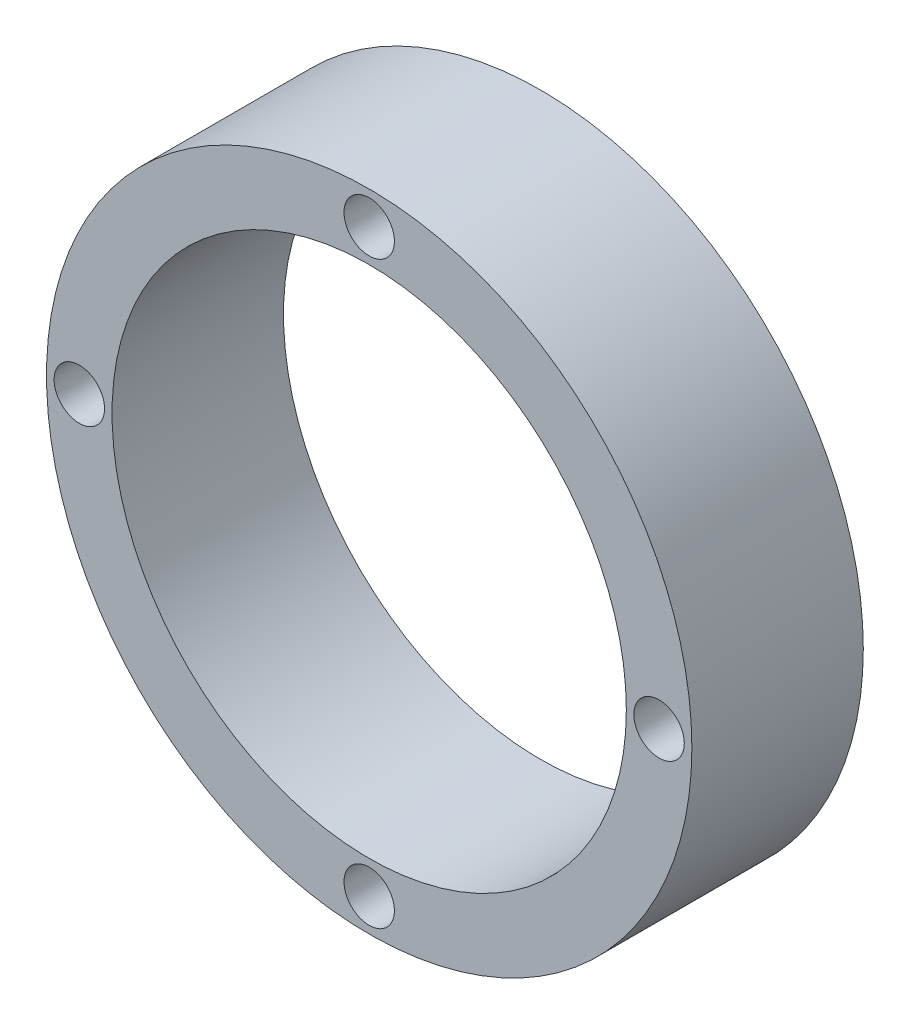
ISO-10303-21;
HEADER;
FILE_DESCRIPTION(('STEP AP214'),'2;1');
FILE_NAME('part.step','',(''),(''),'','','');
FILE_SCHEMA(('AUTOMOTIVE_DESIGN { 1 0 10303 214 1 1 1 1 }'));
ENDSEC;
DATA;
#1=APPLICATION_CONTEXT('core data for automotive mechanical design processes');
#2=APPLICATION_PROTOCOL_DEFINITION('international standard','automotive_design',2000,#1);
#3=PRODUCT_CONTEXT('',#1,'mechanical');
#4=PRODUCT('Part','Part','',(#3));
#5=PRODUCT_RELATED_PRODUCT_CATEGORY('part','',(#4));
#6=PRODUCT_DEFINITION_FORMATION('','',#4);
#7=PRODUCT_DEFINITION_CONTEXT('part definition',#1,'design');
#8=PRODUCT_DEFINITION('design','',#6,#7);
#9=PRODUCT_DEFINITION_SHAPE('','',#8);
#10=(LENGTH_UNIT() NAMED_UNIT(*) SI_UNIT(.MILLI.,.METRE.));
#11=(NAMED_UNIT(*) PLANE_ANGLE_UNIT() SI_UNIT($,.RADIAN.));
#12=(NAMED_UNIT(*) SI_UNIT($,.STERADIAN.) SOLID_ANGLE_UNIT());
#13=UNCERTAINTY_MEASURE_WITH_UNIT(LENGTH_MEASURE(1.E-05),#10,'distance_accuracy_value','');
#14=(GEOMETRIC_REPRESENTATION_CONTEXT(3) GLOBAL_UNCERTAINTY_ASSIGNED_CONTEXT((#13)) GLOBAL_UNIT_ASSIGNED_CONTEXT((#10,
#11,#12)) REPRESENTATION_CONTEXT('',''));
#15=CARTESIAN_POINT('',(0.,0.,0.));
#16=DIRECTION('',(0.,0.,1.));
#17=DIRECTION('',(1.,0.,0.));
#18=AXIS2_PLACEMENT_3D('',#15,#16,#17);
#19=CARTESIAN_POINT('',(0.,0.,17.));
#20=DIRECTION('',(0.,0.,1.));
#21=DIRECTION('',(1.,0.,0.));
#22=AXIS2_PLACEMENT_3D('',#19,#20,#21);
#23=PLANE('',#22);
#24=CARTESIAN_POINT('',(1.6234266883975E-12,-28.7454135368255,17.));
#25=DIRECTION('',(0.,0.,1.));
#26=DIRECTION('',(1.,0.,0.));
#27=AXIS2_PLACEMENT_3D('',#24,#25,#26);
#28=CIRCLE('',#27,2.50000000000174);
#29=CARTESIAN_POINT('',(2.50000000000337,-28.7454135368255,17.));
#30=VERTEX_POINT('',#29);
#31=EDGE_CURVE('E58',#30,#30,#28,.T.);
#32=ORIENTED_EDGE('',*,*,#31,.F.);
#33=EDGE_LOOP('',(#32));
#34=FACE_BOUND('',#33,.T.);
#35=CARTESIAN_POINT('',(0.,28.7454135368255,17.));
#36=DIRECTION('',(0.,0.,1.));
#37=DIRECTION('',(1.,0.,0.));
#38=AXIS2_PLACEMENT_3D('',#35,#36,#37);
#39=CIRCLE('',#38,2.5);
#40=CARTESIAN_POINT('',(2.5,28.7454135368255,17.));
#41=VERTEX_POINT('',#40);
#42=EDGE_CURVE('E46',#41,#41,#39,.T.);
#43=ORIENTED_EDGE('',*,*,#42,.F.);
#44=EDGE_LOOP('',(#43));
#45=FACE_BOUND('',#44,.T.);
#46=CARTESIAN_POINT('',(0.,0.,17.));
#47=DIRECTION('',(0.,0.,1.));
#48=DIRECTION('',(1.,0.,0.));
#49=AXIS2_PLACEMENT_3D('',#46,#47,#48);
#50=CIRCLE('',#49,32.);
#51=CARTESIAN_POINT('',(32.,0.,17.));
#52=VERTEX_POINT('',#51);
#53=EDGE_CURVE('E10',#52,#52,#50,.T.);
#54=ORIENTED_EDGE('',*,*,#53,.T.);
#55=EDGE_LOOP('',(#54));
#56=FACE_BOUND('',#55,.T.);
#57=CARTESIAN_POINT('',(0.,0.,17.));
#58=DIRECTION('',(0.,0.,1.));
#59=DIRECTION('',(1.,0.,0.));
#60=AXIS2_PLACEMENT_3D('',#57,#58,#59);
#61=CIRCLE('',#60,25.5);
#62=CARTESIAN_POINT('',(25.5,0.,17.));
#63=VERTEX_POINT('',#62);
#64=EDGE_CURVE('E41',#63,#63,#61,.T.);
#65=ORIENTED_EDGE('',*,*,#64,.F.);
#66=EDGE_LOOP('',(#65));
#67=FACE_BOUND('',#66,.T.);
#68=CARTESIAN_POINT('',(28.7454135368263,8.1171334419875E-13,17.));
#69=DIRECTION('',(0.,0.,1.));
#70=DIRECTION('',(1.,0.,0.));
#71=AXIS2_PLACEMENT_3D('',#68,#69,#70);
#72=CIRCLE('',#71,2.50000000000064);
#73=CARTESIAN_POINT('',(31.2454135368269,8.1171334419875E-13,17.));
#74=VERTEX_POINT('',#73);
#75=EDGE_CURVE('E52',#74,#74,#72,.T.);
#76=ORIENTED_EDGE('',*,*,#75,.F.);
#77=EDGE_LOOP('',(#76));
#78=FACE_BOUND('',#77,.T.);
#79=CARTESIAN_POINT('',(-28.7454135368247,-8.15233642066554E-13,17.));
#80=DIRECTION('',(0.,0.,1.));
#81=DIRECTION('',(1.,0.,0.));
#82=AXIS2_PLACEMENT_3D('',#79,#80,#81);
#83=CIRCLE('',#82,2.5000000000013);
#84=CARTESIAN_POINT('',(-26.2454135368234,-8.15233642066554E-13,17.));
#85=VERTEX_POINT('',#84);
#86=EDGE_CURVE('E64',#85,#85,#83,.T.);
#87=ORIENTED_EDGE('',*,*,#86,.F.);
#88=EDGE_LOOP('',(#87));
#89=FACE_BOUND('',#88,.T.);
#90=ADVANCED_FACE('F30',(#34,#45,#56,#67,#78,#89),#23,.T.);
#91=CARTESIAN_POINT('',(0.,0.,0.));
#92=DIRECTION('',(0.,0.,1.));
#93=DIRECTION('',(1.,0.,0.));
#94=AXIS2_PLACEMENT_3D('',#91,#92,#93);
#95=PLANE('',#94);
#96=CARTESIAN_POINT('',(0.,0.,0.));
#97=DIRECTION('',(0.,0.,1.));
#98=DIRECTION('',(1.,0.,0.));
#99=AXIS2_PLACEMENT_3D('',#96,#97,#98);
#100=CIRCLE('',#99,32.);
#101=CARTESIAN_POINT('',(32.,0.,0.));
#102=VERTEX_POINT('',#101);
#103=EDGE_CURVE('E34',#102,#102,#100,.T.);
#104=ORIENTED_EDGE('',*,*,#103,.F.);
#105=EDGE_LOOP('',(#104));
#106=FACE_BOUND('',#105,.T.);
#107=CARTESIAN_POINT('',(0.,0.,0.));
#108=DIRECTION('',(0.,0.,1.));
#109=DIRECTION('',(1.,0.,0.));
#110=AXIS2_PLACEMENT_3D('',#107,#108,#109);
#111=CIRCLE('',#110,25.5);
#112=CARTESIAN_POINT('',(25.5,0.,0.));
#113=VERTEX_POINT('',#112);
#114=EDGE_CURVE('E43',#113,#113,#111,.T.);
#115=ORIENTED_EDGE('',*,*,#114,.T.);
#116=EDGE_LOOP('',(#115));
#117=FACE_BOUND('',#116,.T.);
#118=CARTESIAN_POINT('',(0.,28.7454135368255,0.));
#119=DIRECTION('',(0.,0.,1.));
#120=DIRECTION('',(1.,0.,0.));
#121=AXIS2_PLACEMENT_3D('',#118,#119,#120);
#122=CIRCLE('',#121,2.5);
#123=CARTESIAN_POINT('',(2.5,28.7454135368255,0.));
#124=VERTEX_POINT('',#123);
#125=EDGE_CURVE('E49',#124,#124,#122,.T.);
#126=ORIENTED_EDGE('',*,*,#125,.T.);
#127=EDGE_LOOP('',(#126));
#128=FACE_BOUND('',#127,.T.);
#129=CARTESIAN_POINT('',(28.7454135368263,8.1171334419875E-13,0.));
#130=DIRECTION('',(0.,0.,1.));
#131=DIRECTION('',(1.,0.,0.));
#132=AXIS2_PLACEMENT_3D('',#129,#130,#131);
#133=CIRCLE('',#132,2.50000000000064);
#134=CARTESIAN_POINT('',(31.2454135368269,8.1171334419875E-13,0.));
#135=VERTEX_POINT('',#134);
#136=EDGE_CURVE('E55',#135,#135,#133,.T.);
#137=ORIENTED_EDGE('',*,*,#136,.T.);
#138=EDGE_LOOP('',(#137));
#139=FACE_BOUND('',#138,.T.);
#140=CARTESIAN_POINT('',(1.6234266883975E-12,-28.7454135368255,0.));
#141=DIRECTION('',(0.,0.,1.));
#142=DIRECTION('',(1.,0.,0.));
#143=AXIS2_PLACEMENT_3D('',#140,#141,#142);
#144=CIRCLE('',#143,2.50000000000174);
#145=CARTESIAN_POINT('',(2.50000000000337,-28.7454135368255,0.));
#146=VERTEX_POINT('',#145);
#147=EDGE_CURVE('E61',#146,#146,#144,.T.);
#148=ORIENTED_EDGE('',*,*,#147,.T.);
#149=EDGE_LOOP('',(#148));
#150=FACE_BOUND('',#149,.T.);
#151=CARTESIAN_POINT('',(-28.7454135368247,-8.15233642066554E-13,0.));
#152=DIRECTION('',(0.,0.,1.));
#153=DIRECTION('',(1.,0.,0.));
#154=AXIS2_PLACEMENT_3D('',#151,#152,#153);
#155=CIRCLE('',#154,2.5000000000013);
#156=CARTESIAN_POINT('',(-26.2454135368234,-8.15233642066554E-13,0.));
#157=VERTEX_POINT('',#156);
#158=EDGE_CURVE('E67',#157,#157,#155,.T.);
#159=ORIENTED_EDGE('',*,*,#158,.T.);
#160=EDGE_LOOP('',(#159));
#161=FACE_BOUND('',#160,.T.);
#162=ADVANCED_FACE('F77',(#106,#117,#128,#139,#150,#161),#95,.F.);
#163=CARTESIAN_POINT('',(0.,0.,17.));
#164=DIRECTION('',(0.,0.,-1.));
#165=DIRECTION('',(-1.,0.,0.));
#166=AXIS2_PLACEMENT_3D('',#163,#164,#165);
#167=CYLINDRICAL_SURFACE('',#166,32.);
#168=ORIENTED_EDGE('',*,*,#53,.F.);
#169=EDGE_LOOP('',(#168));
#170=FACE_BOUND('',#169,.T.);
#171=ORIENTED_EDGE('',*,*,#103,.T.);
#172=EDGE_LOOP('',(#171));
#173=FACE_BOUND('',#172,.T.);
#174=ADVANCED_FACE('F32',(#170,#173),#167,.T.);
#175=CARTESIAN_POINT('',(0.,0.,17.));
#176=DIRECTION('',(0.,0.,-1.));
#177=DIRECTION('',(-1.,0.,0.));
#178=AXIS2_PLACEMENT_3D('',#175,#176,#177);
#179=CYLINDRICAL_SURFACE('',#178,25.5);
#180=ORIENTED_EDGE('',*,*,#64,.T.);
#181=EDGE_LOOP('',(#180));
#182=FACE_BOUND('',#181,.T.);
#183=ORIENTED_EDGE('',*,*,#114,.F.);
#184=EDGE_LOOP('',(#183));
#185=FACE_BOUND('',#184,.T.);
#186=ADVANCED_FACE('F87',(#182,#185),#179,.F.);
#187=CARTESIAN_POINT('',(0.,28.7454135368255,17.));
#188=DIRECTION('',(0.,0.,-1.));
#189=DIRECTION('',(-1.,0.,0.));
#190=AXIS2_PLACEMENT_3D('',#187,#188,#189);
#191=CYLINDRICAL_SURFACE('',#190,2.5);
#192=ORIENTED_EDGE('',*,*,#42,.T.);
#193=EDGE_LOOP('',(#192));
#194=FACE_BOUND('',#193,.T.);
#195=ORIENTED_EDGE('',*,*,#125,.F.);
#196=EDGE_LOOP('',(#195));
#197=FACE_BOUND('',#196,.T.);
#198=ADVANCED_FACE('F90',(#194,#197),#191,.F.);
#199=CARTESIAN_POINT('',(28.7454135368263,8.1171334419875E-13,17.));
#200=DIRECTION('',(0.,0.,-1.));
#201=DIRECTION('',(-1.,0.,0.));
#202=AXIS2_PLACEMENT_3D('',#199,#200,#201);
#203=CYLINDRICAL_SURFACE('',#202,2.50000000000064);
#204=ORIENTED_EDGE('',*,*,#75,.T.);
#205=EDGE_LOOP('',(#204));
#206=FACE_BOUND('',#205,.T.);
#207=ORIENTED_EDGE('',*,*,#136,.F.);
#208=EDGE_LOOP('',(#207));
#209=FACE_BOUND('',#208,.T.);
#210=ADVANCED_FACE('F94',(#206,#209),#203,.F.);
#211=CARTESIAN_POINT('',(1.6234266883975E-12,-28.7454135368255,17.));
#212=DIRECTION('',(0.,0.,-1.));
#213=DIRECTION('',(-1.,0.,0.));
#214=AXIS2_PLACEMENT_3D('',#211,#212,#213);
#215=CYLINDRICAL_SURFACE('',#214,2.50000000000174);
#216=ORIENTED_EDGE('',*,*,#31,.T.);
#217=EDGE_LOOP('',(#216));
#218=FACE_BOUND('',#217,.T.);
#219=ORIENTED_EDGE('',*,*,#147,.F.);
#220=EDGE_LOOP('',(#219));
#221=FACE_BOUND('',#220,.T.);
#222=ADVANCED_FACE('F98',(#218,#221),#215,.F.);
#223=CARTESIAN_POINT('',(-28.7454135368247,-8.15233642066554E-13,17.));
#224=DIRECTION('',(0.,0.,-1.));
#225=DIRECTION('',(-1.,0.,0.));
#226=AXIS2_PLACEMENT_3D('',#223,#224,#225);
#227=CYLINDRICAL_SURFACE('',#226,2.5000000000013);
#228=ORIENTED_EDGE('',*,*,#86,.T.);
#229=EDGE_LOOP('',(#228));
#230=FACE_BOUND('',#229,.T.);
#231=ORIENTED_EDGE('',*,*,#158,.F.);
#232=EDGE_LOOP('',(#231));
#233=FACE_BOUND('',#232,.T.);
#234=ADVANCED_FACE('F73',(#230,#233),#227,.F.);
#235=CLOSED_SHELL('',(#90,#162,#174,#186,#198,#210,#222,#234));
#236=MANIFOLD_SOLID_BREP('B2',#235);
#237=ADVANCED_BREP_SHAPE_REPRESENTATION('',(#18,#236),#14);
#238=SHAPE_DEFINITION_REPRESENTATION(#9,#237);
ENDSEC;
END-ISO-10303-21;
